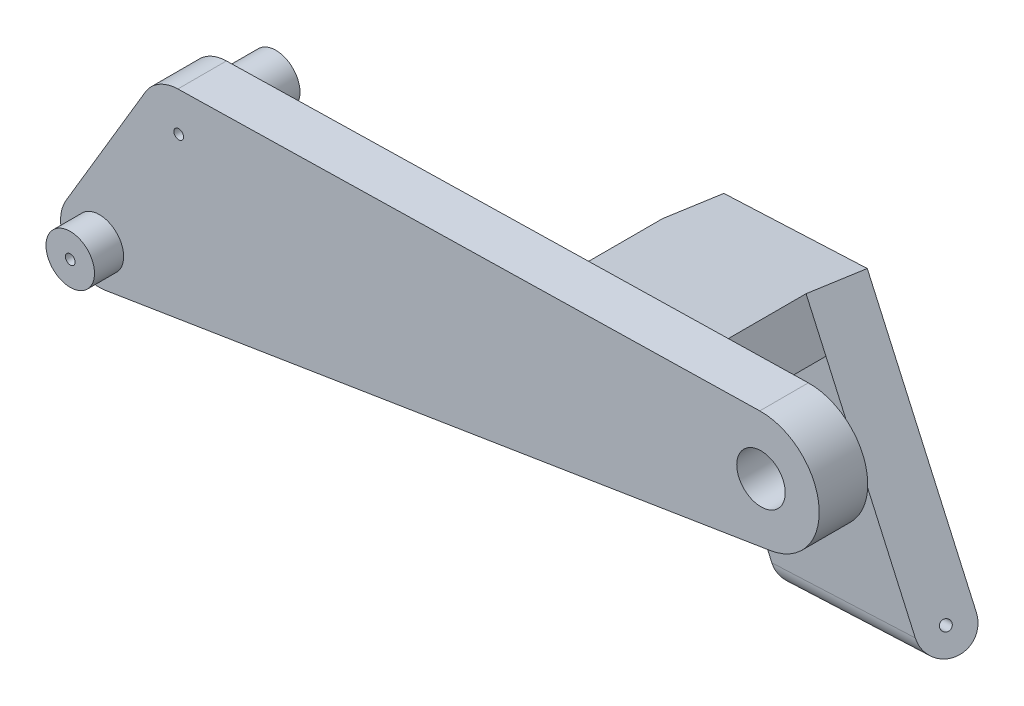
ISO-10303-21;
HEADER;
FILE_DESCRIPTION(('STEP AP214'),'2;1');
FILE_NAME('part.step','',(''),(''),'','','');
FILE_SCHEMA(('AUTOMOTIVE_DESIGN { 1 0 10303 214 1 1 1 1 }'));
ENDSEC;
DATA;
#1=APPLICATION_CONTEXT('core data for automotive mechanical design processes');
#2=APPLICATION_PROTOCOL_DEFINITION('international standard','automotive_design',2000,#1);
#3=PRODUCT_CONTEXT('',#1,'mechanical');
#4=PRODUCT('Part','Part','',(#3));
#5=PRODUCT_RELATED_PRODUCT_CATEGORY('part','',(#4));
#6=PRODUCT_DEFINITION_FORMATION('','',#4);
#7=PRODUCT_DEFINITION_CONTEXT('part definition',#1,'design');
#8=PRODUCT_DEFINITION('design','',#6,#7);
#9=PRODUCT_DEFINITION_SHAPE('','',#8);
#10=(LENGTH_UNIT() NAMED_UNIT(*) SI_UNIT(.MILLI.,.METRE.));
#11=(NAMED_UNIT(*) PLANE_ANGLE_UNIT() SI_UNIT($,.RADIAN.));
#12=(NAMED_UNIT(*) SI_UNIT($,.STERADIAN.) SOLID_ANGLE_UNIT());
#13=UNCERTAINTY_MEASURE_WITH_UNIT(LENGTH_MEASURE(1.E-05),#10,'distance_accuracy_value','');
#14=(GEOMETRIC_REPRESENTATION_CONTEXT(3) GLOBAL_UNCERTAINTY_ASSIGNED_CONTEXT((#13)) GLOBAL_UNIT_ASSIGNED_CONTEXT((#10,
#11,#12)) REPRESENTATION_CONTEXT('',''));
#15=CARTESIAN_POINT('',(0.,0.,0.));
#16=DIRECTION('',(0.,0.,1.));
#17=DIRECTION('',(1.,0.,0.));
#18=AXIS2_PLACEMENT_3D('',#15,#16,#17);
#19=CARTESIAN_POINT('',(62.4855106396352,-20.8616321514098,-11.5630037190644));
#20=DIRECTION('',(-0.851630372481686,-0.38188587271306,-0.359010987142299));
#21=DIRECTION('',(0.409163435049707,-0.912461113373235,0.));
#22=AXIS2_PLACEMENT_3D('',#19,#20,#21);
#23=CYLINDRICAL_SURFACE('',#22,2.5);
#24=DIRECTION('',(-0.851630372481686,-0.38188587271306,-0.359010987142299));
#25=VECTOR('',#24,1.);
#26=CARTESIAN_POINT('',(28.3053987541113,-36.1885888671463,-28.6504502948407));
#27=LINE('',#26,#25);
#28=CARTESIAN_POINT('',(63.304469552238,-20.4943967296105,-13.8963370523977));
#29=VERTEX_POINT('',#28);
#30=CARTESIAN_POINT('',(37.7555583777873,-31.9509729110023,-24.6666666666667));
#31=VERTEX_POINT('',#30);
#32=EDGE_CURVE('E137',#29,#31,#27,.T.);
#33=ORIENTED_EDGE('',*,*,#32,.F.);
#34=CARTESIAN_POINT('',(62.4855106396352,-20.8616321514098,-11.5630037190644));
#35=DIRECTION('',(-0.851630372481687,-0.38188587271306,-0.3590109871423));
#36=DIRECTION('',(0.409163435049707,-0.912461113373235,0.));
#37=AXIS2_PLACEMENT_3D('',#34,#35,#36);
#38=CIRCLE('',#37,2.5);
#39=CARTESIAN_POINT('',(61.6665517270325,-21.2288675732091,-9.22967038573104));
#40=VERTEX_POINT('',#39);
#41=EDGE_CURVE('E48',#40,#29,#38,.F.);
#42=ORIENTED_EDGE('',*,*,#41,.F.);
#43=DIRECTION('',(0.851630372481686,0.38188587271306,0.359010987142299));
#44=VECTOR('',#43,1.);
#45=CARTESIAN_POINT('',(61.6665517270325,-21.2288675732091,-9.22967038573105));
#46=LINE('',#45,#44);
#47=CARTESIAN_POINT('',(36.1176405525819,-32.6854437546009,-20.));
#48=VERTEX_POINT('',#47);
#49=EDGE_CURVE('E263',#48,#40,#46,.T.);
#50=ORIENTED_EDGE('',*,*,#49,.F.);
#51=CARTESIAN_POINT('',(36.9365994651846,-32.3182083328016,-22.3333333333334));
#52=DIRECTION('',(0.851630372481687,0.38188587271306,0.3590109871423));
#53=DIRECTION('',(-0.409163435049707,0.912461113373235,0.));
#54=AXIS2_PLACEMENT_3D('',#51,#52,#53);
#55=CIRCLE('',#54,2.5);
#56=EDGE_CURVE('E11',#31,#48,#55,.F.);
#57=ORIENTED_EDGE('',*,*,#56,.F.);
#58=EDGE_LOOP('',(#33,#42,#50,#57));
#59=FACE_BOUND('',#58,.T.);
#60=ADVANCED_FACE('F40',(#59),#23,.T.);
#61=CARTESIAN_POINT('',(0.,0.,0.));
#62=DIRECTION('',(0.,0.,1.));
#63=DIRECTION('',(1.,0.,0.));
#64=AXIS2_PLACEMENT_3D('',#61,#62,#63);
#65=PLANE('',#64);
#66=CARTESIAN_POINT('',(-8.17183168360859,-13.7557684966988,0.));
#67=DIRECTION('',(0.,0.,-1.));
#68=DIRECTION('',(-1.,0.,0.));
#69=AXIS2_PLACEMENT_3D('',#66,#67,#68);
#70=CIRCLE('',#69,0.500000000000003);
#71=CARTESIAN_POINT('',(-8.67183168360859,-13.7557684966988,0.));
#72=VERTEX_POINT('',#71);
#73=EDGE_CURVE('E191',#72,#72,#70,.T.);
#74=ORIENTED_EDGE('',*,*,#73,.F.);
#75=EDGE_LOOP('',(#74));
#76=FACE_BOUND('',#75,.T.);
#77=CARTESIAN_POINT('',(0.,0.,0.));
#78=DIRECTION('',(0.,0.,1.));
#79=DIRECTION('',(1.,0.,0.));
#80=AXIS2_PLACEMENT_3D('',#77,#78,#79);
#81=CIRCLE('',#80,2.5);
#82=CARTESIAN_POINT('',(2.5,0.,0.));
#83=VERTEX_POINT('',#82);
#84=EDGE_CURVE('E211',#83,#83,#81,.T.);
#85=ORIENTED_EDGE('',*,*,#84,.T.);
#86=EDGE_LOOP('',(#85));
#87=FACE_BOUND('',#86,.T.);
#88=CARTESIAN_POINT('',(60.,-0.746793782929104,0.));
#89=DIRECTION('',(0.,0.,-1.));
#90=DIRECTION('',(-1.,0.,0.));
#91=AXIS2_PLACEMENT_3D('',#88,#89,#90);
#92=CIRCLE('',#91,2.49999999999999);
#93=CARTESIAN_POINT('',(57.5,-0.746793782929104,0.));
#94=VERTEX_POINT('',#93);
#95=EDGE_CURVE('E187',#94,#94,#92,.T.);
#96=ORIENTED_EDGE('',*,*,#95,.F.);
#97=EDGE_LOOP('',(#96));
#98=FACE_BOUND('',#97,.T.);
#99=DIRECTION('',(-0.409163435049708,0.912461113373235,0.));
#100=VECTOR('',#99,1.);
#101=CARTESIAN_POINT('',(26.9114632639635,-12.1550687037031,0.));
#102=LINE('',#101,#100);
#103=CARTESIAN_POINT('',(26.9114632639635,-12.1550687037031,0.));
#104=VERTEX_POINT('',#103);
#105=CARTESIAN_POINT('',(24.8656460887149,-7.59276313683697,0.));
#106=VERTEX_POINT('',#105);
#107=EDGE_CURVE('E165',#104,#106,#102,.T.);
#108=ORIENTED_EDGE('',*,*,#107,.F.);
#109=DIRECTION('',(0.987269044442118,0.159059215031218,0.));
#110=VECTOR('',#109,1.);
#111=CARTESIAN_POINT('',(60.9543552901873,-6.67040804958181,0.));
#112=LINE('',#111,#110);
#113=CARTESIAN_POINT('',(-7.53559482348372,-17.7048446744673,0.));
#114=VERTEX_POINT('',#113);
#115=EDGE_CURVE('E240',#114,#104,#112,.T.);
#116=ORIENTED_EDGE('',*,*,#115,.F.);
#117=CARTESIAN_POINT('',(-8.17183168360859,-13.7557684966988,0.));
#118=DIRECTION('',(0.,0.,1.));
#119=DIRECTION('',(1.,0.,0.));
#120=AXIS2_PLACEMENT_3D('',#117,#118,#119);
#121=CIRCLE('',#120,4.);
#122=CARTESIAN_POINT('',(-11.6107738077833,-11.7128105757966,0.));
#123=VERTEX_POINT('',#122);
#124=EDGE_CURVE('E237',#123,#114,#121,.T.);
#125=ORIENTED_EDGE('',*,*,#124,.F.);
#126=DIRECTION('',(-0.510739480225537,-0.859735531043674,0.));
#127=VECTOR('',#126,1.);
#128=CARTESIAN_POINT('',(-11.6107738077833,-11.7128105757966,0.));
#129=LINE('',#128,#127);
#130=CARTESIAN_POINT('',(-3.4389421241747,2.04295792090215,0.));
#131=VERTEX_POINT('',#130);
#132=EDGE_CURVE('E235',#131,#123,#129,.T.);
#133=ORIENTED_EDGE('',*,*,#132,.F.);
#134=CARTESIAN_POINT('',(0.,0.,0.));
#135=DIRECTION('',(0.,0.,1.));
#136=DIRECTION('',(1.,0.,0.));
#137=AXIS2_PLACEMENT_3D('',#134,#135,#136);
#138=CIRCLE('',#137,4.);
#139=CARTESIAN_POINT('',(-0.0835579449526009,3.99912716349897,0.));
#140=VERTEX_POINT('',#139);
#141=EDGE_CURVE('E217',#140,#131,#138,.T.);
#142=ORIENTED_EDGE('',*,*,#141,.F.);
#143=DIRECTION('',(-0.999781790874742,-0.0208894862381503,0.));
#144=VECTOR('',#143,1.);
#145=CARTESIAN_POINT('',(-0.0835579449526009,3.99912716349897,0.));
#146=LINE('',#145,#144);
#147=CARTESIAN_POINT('',(59.8746630825711,5.25189696231935,0.));
#148=VERTEX_POINT('',#147);
#149=EDGE_CURVE('E222',#148,#140,#146,.T.);
#150=ORIENTED_EDGE('',*,*,#149,.F.);
#151=CARTESIAN_POINT('',(60.,-0.746793782929104,0.));
#152=DIRECTION('',(0.,0.,1.));
#153=DIRECTION('',(1.,0.,0.));
#154=AXIS2_PLACEMENT_3D('',#151,#152,#153);
#155=CIRCLE('',#154,6.);
#156=CARTESIAN_POINT('',(60.9543552901873,-6.67040804958181,0.));
#157=VERTEX_POINT('',#156);
#158=EDGE_CURVE('E242',#157,#148,#155,.T.);
#159=ORIENTED_EDGE('',*,*,#158,.F.);
#160=EDGE_CURVE('E239',#104,#157,#112,.T.);
#161=ORIENTED_EDGE('',*,*,#160,.F.);
#162=DIRECTION('',(-0.912461113373235,-0.409163435049707,0.));
#163=VECTOR('',#162,1.);
#164=CARTESIAN_POINT('',(26.9114632639635,-12.1550687037031,0.));
#165=LINE('',#164,#163);
#166=CARTESIAN_POINT('',(52.4603744384141,-0.698492522311342,0.));
#167=VERTEX_POINT('',#166);
#168=EDGE_CURVE('E168',#167,#104,#165,.T.);
#169=ORIENTED_EDGE('',*,*,#168,.F.);
#170=DIRECTION('',(0.40916343504971,-0.912461113373234,0.));
#171=VECTOR('',#170,1.);
#172=CARTESIAN_POINT('',(52.4603744384141,-0.698492522311339,0.));
#173=LINE('',#172,#171);
#174=CARTESIAN_POINT('',(50.4145572631655,3.86381304455483,0.));
#175=VERTEX_POINT('',#174);
#176=EDGE_CURVE('E174',#175,#167,#173,.T.);
#177=ORIENTED_EDGE('',*,*,#176,.F.);
#178=DIRECTION('',(0.912461113373235,0.409163435049707,0.));
#179=VECTOR('',#178,1.);
#180=CARTESIAN_POINT('',(24.8656460887149,-7.59276313683697,0.));
#181=LINE('',#180,#179);
#182=EDGE_CURVE('E171',#106,#175,#181,.T.);
#183=ORIENTED_EDGE('',*,*,#182,.F.);
#184=EDGE_LOOP('',(#108,#116,#125,#133,#142,#150,#159,#161,#169,#177,#183));
#185=FACE_BOUND('',#184,.T.);
#186=ADVANCED_FACE('F298',(#76,#87,#98,#185),#65,.F.);
#187=CARTESIAN_POINT('',(0.,0.,5.));
#188=DIRECTION('',(0.,0.,1.));
#189=DIRECTION('',(1.,0.,0.));
#190=AXIS2_PLACEMENT_3D('',#187,#188,#189);
#191=PLANE('',#190);
#192=CARTESIAN_POINT('',(60.,-0.746793782929104,5.));
#193=DIRECTION('',(0.,0.,-1.));
#194=DIRECTION('',(-1.,0.,0.));
#195=AXIS2_PLACEMENT_3D('',#192,#193,#194);
#196=CIRCLE('',#195,2.49999999999999);
#197=CARTESIAN_POINT('',(57.5,-0.746793782929104,5.));
#198=VERTEX_POINT('',#197);
#199=EDGE_CURVE('E188',#198,#198,#196,.T.);
#200=ORIENTED_EDGE('',*,*,#199,.T.);
#201=EDGE_LOOP('',(#200));
#202=FACE_BOUND('',#201,.T.);
#203=CARTESIAN_POINT('',(-8.17183168360859,-13.7557684966988,5.));
#204=DIRECTION('',(0.,0.,1.));
#205=DIRECTION('',(1.,0.,0.));
#206=AXIS2_PLACEMENT_3D('',#203,#204,#205);
#207=CIRCLE('',#206,2.5);
#208=CARTESIAN_POINT('',(-5.67183168360859,-13.7557684966988,5.));
#209=VERTEX_POINT('',#208);
#210=EDGE_CURVE('E214',#209,#209,#207,.T.);
#211=ORIENTED_EDGE('',*,*,#210,.F.);
#212=EDGE_LOOP('',(#211));
#213=FACE_BOUND('',#212,.T.);
#214=CARTESIAN_POINT('',(0.,0.,5.));
#215=DIRECTION('',(0.,0.,1.));
#216=DIRECTION('',(1.,0.,0.));
#217=AXIS2_PLACEMENT_3D('',#214,#215,#216);
#218=CIRCLE('',#217,4.);
#219=CARTESIAN_POINT('',(-0.0835579449526009,3.99912716349897,5.));
#220=VERTEX_POINT('',#219);
#221=CARTESIAN_POINT('',(-3.4389421241747,2.04295792090215,5.));
#222=VERTEX_POINT('',#221);
#223=EDGE_CURVE('E218',#220,#222,#218,.T.);
#224=ORIENTED_EDGE('',*,*,#223,.T.);
#225=DIRECTION('',(-0.510739480225537,-0.859735531043674,0.));
#226=VECTOR('',#225,1.);
#227=CARTESIAN_POINT('',(-11.6107738077833,-11.7128105757966,5.));
#228=LINE('',#227,#226);
#229=CARTESIAN_POINT('',(-11.6107738077833,-11.7128105757966,5.));
#230=VERTEX_POINT('',#229);
#231=EDGE_CURVE('E221',#222,#230,#228,.T.);
#232=ORIENTED_EDGE('',*,*,#231,.T.);
#233=CARTESIAN_POINT('',(-8.17183168360859,-13.7557684966988,5.));
#234=DIRECTION('',(0.,0.,1.));
#235=DIRECTION('',(1.,0.,0.));
#236=AXIS2_PLACEMENT_3D('',#233,#234,#235);
#237=CIRCLE('',#236,4.);
#238=CARTESIAN_POINT('',(-7.53559482348372,-17.7048446744673,5.));
#239=VERTEX_POINT('',#238);
#240=EDGE_CURVE('E224',#230,#239,#237,.T.);
#241=ORIENTED_EDGE('',*,*,#240,.T.);
#242=DIRECTION('',(0.987269044442118,0.159059215031218,0.));
#243=VECTOR('',#242,1.);
#244=CARTESIAN_POINT('',(60.9543552901873,-6.67040804958181,5.));
#245=LINE('',#244,#243);
#246=CARTESIAN_POINT('',(60.9543552901873,-6.67040804958181,5.));
#247=VERTEX_POINT('',#246);
#248=EDGE_CURVE('E226',#239,#247,#245,.T.);
#249=ORIENTED_EDGE('',*,*,#248,.T.);
#250=CARTESIAN_POINT('',(60.,-0.746793782929104,5.));
#251=DIRECTION('',(0.,0.,1.));
#252=DIRECTION('',(1.,0.,0.));
#253=AXIS2_PLACEMENT_3D('',#250,#251,#252);
#254=CIRCLE('',#253,6.);
#255=CARTESIAN_POINT('',(59.8746630825711,5.25189696231935,5.));
#256=VERTEX_POINT('',#255);
#257=EDGE_CURVE('E228',#247,#256,#254,.T.);
#258=ORIENTED_EDGE('',*,*,#257,.T.);
#259=DIRECTION('',(-0.999781790874742,-0.0208894862381503,0.));
#260=VECTOR('',#259,1.);
#261=CARTESIAN_POINT('',(-0.0835579449526009,3.99912716349897,5.));
#262=LINE('',#261,#260);
#263=EDGE_CURVE('E230',#256,#220,#262,.T.);
#264=ORIENTED_EDGE('',*,*,#263,.T.);
#265=EDGE_LOOP('',(#224,#232,#241,#249,#258,#264));
#266=FACE_BOUND('',#265,.T.);
#267=CARTESIAN_POINT('',(0.,0.,5.));
#268=DIRECTION('',(0.,0.,1.));
#269=DIRECTION('',(1.,0.,0.));
#270=AXIS2_PLACEMENT_3D('',#267,#268,#269);
#271=CIRCLE('',#270,0.5);
#272=CARTESIAN_POINT('',(0.5,0.,5.));
#273=VERTEX_POINT('',#272);
#274=EDGE_CURVE('E202',#273,#273,#271,.T.);
#275=ORIENTED_EDGE('',*,*,#274,.F.);
#276=EDGE_LOOP('',(#275));
#277=FACE_BOUND('',#276,.T.);
#278=ADVANCED_FACE('F302',(#202,#213,#266,#277),#191,.T.);
#279=CARTESIAN_POINT('',(0.,0.,5.));
#280=DIRECTION('',(0.,0.,-1.));
#281=DIRECTION('',(-1.,0.,0.));
#282=AXIS2_PLACEMENT_3D('',#279,#280,#281);
#283=CYLINDRICAL_SURFACE('',#282,4.);
#284=ORIENTED_EDGE('',*,*,#141,.T.);
#285=DIRECTION('',(0.,0.,-1.));
#286=VECTOR('',#285,1.);
#287=CARTESIAN_POINT('',(-3.4389421241747,2.04295792090215,5.));
#288=LINE('',#287,#286);
#289=EDGE_CURVE('E259',#222,#131,#288,.T.);
#290=ORIENTED_EDGE('',*,*,#289,.F.);
#291=ORIENTED_EDGE('',*,*,#223,.F.);
#292=DIRECTION('',(0.,0.,-1.));
#293=VECTOR('',#292,1.);
#294=CARTESIAN_POINT('',(-0.0835579449526009,3.99912716349897,5.));
#295=LINE('',#294,#293);
#296=EDGE_CURVE('E232',#220,#140,#295,.T.);
#297=ORIENTED_EDGE('',*,*,#296,.T.);
#298=EDGE_LOOP('',(#284,#290,#291,#297));
#299=FACE_BOUND('',#298,.T.);
#300=ADVANCED_FACE('F308',(#299),#283,.T.);
#301=CARTESIAN_POINT('',(-11.6107738077833,-11.7128105757966,5.));
#302=DIRECTION('',(0.859735531043674,-0.510739480225537,0.));
#303=DIRECTION('',(0.510739480225537,0.859735531043674,0.));
#304=AXIS2_PLACEMENT_3D('',#301,#302,#303);
#305=PLANE('',#304);
#306=ORIENTED_EDGE('',*,*,#132,.T.);
#307=DIRECTION('',(0.,0.,-1.));
#308=VECTOR('',#307,1.);
#309=CARTESIAN_POINT('',(-11.6107738077833,-11.7128105757966,5.));
#310=LINE('',#309,#308);
#311=EDGE_CURVE('E256',#230,#123,#310,.T.);
#312=ORIENTED_EDGE('',*,*,#311,.F.);
#313=ORIENTED_EDGE('',*,*,#231,.F.);
#314=ORIENTED_EDGE('',*,*,#289,.T.);
#315=EDGE_LOOP('',(#306,#312,#313,#314));
#316=FACE_BOUND('',#315,.T.);
#317=ADVANCED_FACE('F331',(#316),#305,.F.);
#318=CARTESIAN_POINT('',(-8.17183168360859,-13.7557684966988,5.));
#319=DIRECTION('',(0.,0.,-1.));
#320=DIRECTION('',(-1.,0.,0.));
#321=AXIS2_PLACEMENT_3D('',#318,#319,#320);
#322=CYLINDRICAL_SURFACE('',#321,4.);
#323=ORIENTED_EDGE('',*,*,#124,.T.);
#324=DIRECTION('',(0.,0.,-1.));
#325=VECTOR('',#324,1.);
#326=CARTESIAN_POINT('',(-7.53559482348372,-17.7048446744673,5.));
#327=LINE('',#326,#325);
#328=EDGE_CURVE('E253',#239,#114,#327,.T.);
#329=ORIENTED_EDGE('',*,*,#328,.F.);
#330=ORIENTED_EDGE('',*,*,#240,.F.);
#331=ORIENTED_EDGE('',*,*,#311,.T.);
#332=EDGE_LOOP('',(#323,#329,#330,#331));
#333=FACE_BOUND('',#332,.T.);
#334=ADVANCED_FACE('F327',(#333),#322,.T.);
#335=CARTESIAN_POINT('',(60.9543552901873,-6.67040804958181,5.));
#336=DIRECTION('',(-0.159059215031218,0.987269044442118,0.));
#337=DIRECTION('',(-0.987269044442118,-0.159059215031218,0.));
#338=AXIS2_PLACEMENT_3D('',#335,#336,#337);
#339=PLANE('',#338);
#340=ORIENTED_EDGE('',*,*,#115,.T.);
#341=ORIENTED_EDGE('',*,*,#160,.T.);
#342=DIRECTION('',(0.,0.,-1.));
#343=VECTOR('',#342,1.);
#344=CARTESIAN_POINT('',(60.9543552901873,-6.67040804958181,5.));
#345=LINE('',#344,#343);
#346=EDGE_CURVE('E250',#247,#157,#345,.T.);
#347=ORIENTED_EDGE('',*,*,#346,.F.);
#348=ORIENTED_EDGE('',*,*,#248,.F.);
#349=ORIENTED_EDGE('',*,*,#328,.T.);
#350=EDGE_LOOP('',(#340,#341,#347,#348,#349));
#351=FACE_BOUND('',#350,.T.);
#352=ADVANCED_FACE('F323',(#351),#339,.F.);
#353=CARTESIAN_POINT('',(60.,-0.746793782929104,5.));
#354=DIRECTION('',(0.,0.,-1.));
#355=DIRECTION('',(-1.,0.,0.));
#356=AXIS2_PLACEMENT_3D('',#353,#354,#355);
#357=CYLINDRICAL_SURFACE('',#356,6.);
#358=ORIENTED_EDGE('',*,*,#158,.T.);
#359=DIRECTION('',(0.,0.,-1.));
#360=VECTOR('',#359,1.);
#361=CARTESIAN_POINT('',(59.8746630825711,5.25189696231935,5.));
#362=LINE('',#361,#360);
#363=EDGE_CURVE('E247',#256,#148,#362,.T.);
#364=ORIENTED_EDGE('',*,*,#363,.F.);
#365=ORIENTED_EDGE('',*,*,#257,.F.);
#366=ORIENTED_EDGE('',*,*,#346,.T.);
#367=EDGE_LOOP('',(#358,#364,#365,#366));
#368=FACE_BOUND('',#367,.T.);
#369=ADVANCED_FACE('F319',(#368),#357,.T.);
#370=CARTESIAN_POINT('',(-0.0835579449526009,3.99912716349897,5.));
#371=DIRECTION('',(0.0208894862381503,-0.999781790874742,0.));
#372=DIRECTION('',(0.999781790874742,0.0208894862381503,0.));
#373=AXIS2_PLACEMENT_3D('',#370,#371,#372);
#374=PLANE('',#373);
#375=ORIENTED_EDGE('',*,*,#149,.T.);
#376=ORIENTED_EDGE('',*,*,#296,.F.);
#377=ORIENTED_EDGE('',*,*,#263,.F.);
#378=ORIENTED_EDGE('',*,*,#363,.T.);
#379=EDGE_LOOP('',(#375,#376,#377,#378));
#380=FACE_BOUND('',#379,.T.);
#381=ADVANCED_FACE('F315',(#380),#374,.F.);
#382=CARTESIAN_POINT('',(0.,0.,-5.));
#383=DIRECTION('',(0.,0.,1.));
#384=DIRECTION('',(1.,0.,0.));
#385=AXIS2_PLACEMENT_3D('',#382,#383,#384);
#386=CYLINDRICAL_SURFACE('',#385,2.5);
#387=CARTESIAN_POINT('',(0.,0.,-5.));
#388=DIRECTION('',(0.,0.,1.));
#389=DIRECTION('',(1.,0.,0.));
#390=AXIS2_PLACEMENT_3D('',#387,#388,#389);
#391=CIRCLE('',#390,2.5);
#392=CARTESIAN_POINT('',(2.5,0.,-5.));
#393=VERTEX_POINT('',#392);
#394=EDGE_CURVE('E206',#393,#393,#391,.T.);
#395=ORIENTED_EDGE('',*,*,#394,.T.);
#396=EDGE_LOOP('',(#395));
#397=FACE_BOUND('',#396,.T.);
#398=ORIENTED_EDGE('',*,*,#84,.F.);
#399=EDGE_LOOP('',(#398));
#400=FACE_BOUND('',#399,.T.);
#401=ADVANCED_FACE('F318',(#397,#400),#386,.T.);
#402=CARTESIAN_POINT('',(0.,0.,-5.));
#403=DIRECTION('',(0.,0.,1.));
#404=DIRECTION('',(1.,0.,0.));
#405=AXIS2_PLACEMENT_3D('',#402,#403,#404);
#406=PLANE('',#405);
#407=CARTESIAN_POINT('',(0.,0.,-5.));
#408=DIRECTION('',(0.,0.,1.));
#409=DIRECTION('',(1.,0.,0.));
#410=AXIS2_PLACEMENT_3D('',#407,#408,#409);
#411=CIRCLE('',#410,0.5);
#412=CARTESIAN_POINT('',(0.5,0.,-5.));
#413=VERTEX_POINT('',#412);
#414=EDGE_CURVE('E203',#413,#413,#411,.T.);
#415=ORIENTED_EDGE('',*,*,#414,.T.);
#416=EDGE_LOOP('',(#415));
#417=FACE_BOUND('',#416,.T.);
#418=ORIENTED_EDGE('',*,*,#394,.F.);
#419=EDGE_LOOP('',(#418));
#420=FACE_BOUND('',#419,.T.);
#421=ADVANCED_FACE('F396',(#417,#420),#406,.F.);
#422=CARTESIAN_POINT('',(0.,0.,-5.));
#423=DIRECTION('',(0.,0.,1.));
#424=DIRECTION('',(1.,0.,0.));
#425=AXIS2_PLACEMENT_3D('',#422,#423,#424);
#426=CYLINDRICAL_SURFACE('',#425,0.5);
#427=ORIENTED_EDGE('',*,*,#414,.F.);
#428=EDGE_LOOP('',(#427));
#429=FACE_BOUND('',#428,.T.);
#430=ORIENTED_EDGE('',*,*,#274,.T.);
#431=EDGE_LOOP('',(#430));
#432=FACE_BOUND('',#431,.T.);
#433=ADVANCED_FACE('F392',(#429,#432),#426,.F.);
#434=CARTESIAN_POINT('',(-8.17183168360859,-13.7557684966988,8.));
#435=DIRECTION('',(0.,0.,-1.));
#436=DIRECTION('',(-1.,0.,0.));
#437=AXIS2_PLACEMENT_3D('',#434,#435,#436);
#438=CYLINDRICAL_SURFACE('',#437,2.5);
#439=ORIENTED_EDGE('',*,*,#210,.T.);
#440=EDGE_LOOP('',(#439));
#441=FACE_BOUND('',#440,.T.);
#442=CARTESIAN_POINT('',(-8.17183168360859,-13.7557684966988,8.));
#443=DIRECTION('',(0.,0.,-1.));
#444=DIRECTION('',(-1.,0.,0.));
#445=AXIS2_PLACEMENT_3D('',#442,#443,#444);
#446=CIRCLE('',#445,2.5);
#447=CARTESIAN_POINT('',(-10.6718316836086,-13.7557684966988,8.));
#448=VERTEX_POINT('',#447);
#449=EDGE_CURVE('E197',#448,#448,#446,.T.);
#450=ORIENTED_EDGE('',*,*,#449,.T.);
#451=EDGE_LOOP('',(#450));
#452=FACE_BOUND('',#451,.T.);
#453=ADVANCED_FACE('F388',(#441,#452),#438,.T.);
#454=CARTESIAN_POINT('',(-8.17183168360859,-13.7557684966988,8.));
#455=DIRECTION('',(0.,0.,-1.));
#456=DIRECTION('',(-1.,0.,0.));
#457=AXIS2_PLACEMENT_3D('',#454,#455,#456);
#458=PLANE('',#457);
#459=CARTESIAN_POINT('',(-8.17183168360859,-13.7557684966988,8.));
#460=DIRECTION('',(0.,0.,-1.));
#461=DIRECTION('',(-1.,0.,0.));
#462=AXIS2_PLACEMENT_3D('',#459,#460,#461);
#463=CIRCLE('',#462,0.500000000000003);
#464=CARTESIAN_POINT('',(-8.67183168360859,-13.7557684966988,8.));
#465=VERTEX_POINT('',#464);
#466=EDGE_CURVE('E194',#465,#465,#463,.T.);
#467=ORIENTED_EDGE('',*,*,#466,.T.);
#468=EDGE_LOOP('',(#467));
#469=FACE_BOUND('',#468,.T.);
#470=ORIENTED_EDGE('',*,*,#449,.F.);
#471=EDGE_LOOP('',(#470));
#472=FACE_BOUND('',#471,.T.);
#473=ADVANCED_FACE('F384',(#469,#472),#458,.F.);
#474=CARTESIAN_POINT('',(-8.17183168360859,-13.7557684966988,8.));
#475=DIRECTION('',(0.,0.,-1.));
#476=DIRECTION('',(-1.,0.,0.));
#477=AXIS2_PLACEMENT_3D('',#474,#475,#476);
#478=CYLINDRICAL_SURFACE('',#477,0.500000000000003);
#479=ORIENTED_EDGE('',*,*,#466,.F.);
#480=EDGE_LOOP('',(#479));
#481=FACE_BOUND('',#480,.T.);
#482=ORIENTED_EDGE('',*,*,#73,.T.);
#483=EDGE_LOOP('',(#482));
#484=FACE_BOUND('',#483,.T.);
#485=ADVANCED_FACE('F380',(#481,#484),#478,.F.);
#486=CARTESIAN_POINT('',(60.,-0.746793782929104,5.));
#487=DIRECTION('',(0.,0.,-1.));
#488=DIRECTION('',(-1.,0.,0.));
#489=AXIS2_PLACEMENT_3D('',#486,#487,#488);
#490=CYLINDRICAL_SURFACE('',#489,2.49999999999999);
#491=ORIENTED_EDGE('',*,*,#199,.F.);
#492=EDGE_LOOP('',(#491));
#493=FACE_BOUND('',#492,.T.);
#494=ORIENTED_EDGE('',*,*,#95,.T.);
#495=EDGE_LOOP('',(#494));
#496=FACE_BOUND('',#495,.T.);
#497=ADVANCED_FACE('F377',(#493,#496),#490,.F.);
#498=CARTESIAN_POINT('',(26.9114632639635,-12.1550687037031,-20.));
#499=DIRECTION('',(0.912461113373235,0.409163435049708,0.));
#500=DIRECTION('',(-0.409163435049708,0.912461113373235,0.));
#501=AXIS2_PLACEMENT_3D('',#498,#499,#500);
#502=PLANE('',#501);
#503=ORIENTED_EDGE('',*,*,#107,.T.);
#504=DIRECTION('',(0.,0.,1.));
#505=VECTOR('',#504,1.);
#506=CARTESIAN_POINT('',(24.8656460887149,-7.59276313683697,-20.));
#507=LINE('',#506,#505);
#508=CARTESIAN_POINT('',(24.865646088715,-7.59276313683697,-20.));
#509=VERTEX_POINT('',#508);
#510=EDGE_CURVE('E185',#509,#106,#507,.T.);
#511=ORIENTED_EDGE('',*,*,#510,.F.);
#512=DIRECTION('',(-0.409163435049708,0.912461113373235,0.));
#513=VECTOR('',#512,1.);
#514=CARTESIAN_POINT('',(26.9114632639635,-12.1550687037031,-20.));
#515=LINE('',#514,#513);
#516=CARTESIAN_POINT('',(26.9114632639635,-12.1550687037031,-20.));
#517=VERTEX_POINT('',#516);
#518=EDGE_CURVE('E154',#517,#509,#515,.T.);
#519=ORIENTED_EDGE('',*,*,#518,.F.);
#520=DIRECTION('',(0.,0.,1.));
#521=VECTOR('',#520,1.);
#522=CARTESIAN_POINT('',(26.9114632639635,-12.1550687037031,-20.));
#523=LINE('',#522,#521);
#524=EDGE_CURVE('E167',#517,#104,#523,.T.);
#525=ORIENTED_EDGE('',*,*,#524,.T.);
#526=EDGE_LOOP('',(#503,#511,#519,#525));
#527=FACE_BOUND('',#526,.T.);
#528=ADVANCED_FACE('F364',(#527),#502,.F.);
#529=CARTESIAN_POINT('',(24.8656460887149,-7.59276313683697,-20.));
#530=DIRECTION('',(0.409163435049707,-0.912461113373235,0.));
#531=DIRECTION('',(0.912461113373235,0.409163435049707,0.));
#532=AXIS2_PLACEMENT_3D('',#529,#530,#531);
#533=PLANE('',#532);
#534=DIRECTION('',(0.,0.,1.));
#535=VECTOR('',#534,1.);
#536=CARTESIAN_POINT('',(50.4145572631655,3.86381304455483,-20.));
#537=LINE('',#536,#535);
#538=CARTESIAN_POINT('',(50.4145572631655,3.86381304455484,-9.22967038573102));
#539=VERTEX_POINT('',#538);
#540=EDGE_CURVE('E183',#539,#175,#537,.T.);
#541=ORIENTED_EDGE('',*,*,#540,.F.);
#542=DIRECTION('',(-0.327583565041087,-0.14689416871973,0.933333333333334));
#543=VECTOR('',#542,1.);
#544=CARTESIAN_POINT('',(52.052475088371,4.59828388815349,-13.8963370523977));
#545=LINE('',#544,#543);
#546=CARTESIAN_POINT('',(52.052475088371,4.59828388815349,-13.8963370523977));
#547=VERTEX_POINT('',#546);
#548=EDGE_CURVE('E148',#547,#539,#545,.T.);
#549=ORIENTED_EDGE('',*,*,#548,.F.);
#550=DIRECTION('',(0.851630372481686,0.38188587271306,0.359010987142299));
#551=VECTOR('',#550,1.);
#552=CARTESIAN_POINT('',(26.5035639139204,-6.85829229323832,-24.6666666666667));
#553=LINE('',#552,#551);
#554=CARTESIAN_POINT('',(26.5035639139204,-6.85829229323832,-24.6666666666667));
#555=VERTEX_POINT('',#554);
#556=EDGE_CURVE('E135',#555,#547,#553,.T.);
#557=ORIENTED_EDGE('',*,*,#556,.F.);
#558=DIRECTION('',(-0.327583565041087,-0.14689416871973,0.933333333333334));
#559=VECTOR('',#558,1.);
#560=CARTESIAN_POINT('',(26.5035639139204,-6.85829229323832,-24.6666666666667));
#561=LINE('',#560,#559);
#562=EDGE_CURVE('E146',#555,#509,#561,.T.);
#563=ORIENTED_EDGE('',*,*,#562,.T.);
#564=ORIENTED_EDGE('',*,*,#510,.T.);
#565=ORIENTED_EDGE('',*,*,#182,.T.);
#566=EDGE_LOOP('',(#541,#549,#557,#563,#564,#565));
#567=FACE_BOUND('',#566,.T.);
#568=ADVANCED_FACE('F144',(#567),#533,.F.);
#569=CARTESIAN_POINT('',(52.4603744384141,-0.698492522311339,-20.));
#570=DIRECTION('',(-0.912461113373234,-0.40916343504971,0.));
#571=DIRECTION('',(0.40916343504971,-0.912461113373234,0.));
#572=AXIS2_PLACEMENT_3D('',#569,#570,#571);
#573=PLANE('',#572);
#574=DIRECTION('',(0.,0.,1.));
#575=VECTOR('',#574,1.);
#576=CARTESIAN_POINT('',(52.4603744384141,-0.698492522311339,-20.));
#577=LINE('',#576,#575);
#578=CARTESIAN_POINT('',(52.4603744384141,-0.698492522311338,-9.22967038573103));
#579=VERTEX_POINT('',#578);
#580=EDGE_CURVE('E181',#579,#167,#577,.T.);
#581=ORIENTED_EDGE('',*,*,#580,.F.);
#582=DIRECTION('',(-0.409163435049707,0.912461113373235,0.));
#583=VECTOR('',#582,1.);
#584=CARTESIAN_POINT('',(52.4603744384141,-0.698492522311339,-9.22967038573102));
#585=LINE('',#584,#583);
#586=EDGE_CURVE('E158',#579,#539,#585,.T.);
#587=ORIENTED_EDGE('',*,*,#586,.T.);
#588=ORIENTED_EDGE('',*,*,#540,.T.);
#589=ORIENTED_EDGE('',*,*,#176,.T.);
#590=EDGE_LOOP('',(#581,#587,#588,#589));
#591=FACE_BOUND('',#590,.T.);
#592=ADVANCED_FACE('F366',(#591),#573,.F.);
#593=CARTESIAN_POINT('',(26.9114632639635,-12.1550687037031,-20.));
#594=DIRECTION('',(-0.409163435049707,0.912461113373235,0.));
#595=DIRECTION('',(-0.912461113373235,-0.409163435049707,0.));
#596=AXIS2_PLACEMENT_3D('',#593,#594,#595);
#597=PLANE('',#596);
#598=ORIENTED_EDGE('',*,*,#524,.F.);
#599=DIRECTION('',(0.851630372481686,0.38188587271306,0.359010987142299));
#600=VECTOR('',#599,1.);
#601=CARTESIAN_POINT('',(52.4603744384141,-0.698492522311339,-9.22967038573102));
#602=LINE('',#601,#600);
#603=EDGE_CURVE('E155',#517,#579,#602,.T.);
#604=ORIENTED_EDGE('',*,*,#603,.T.);
#605=ORIENTED_EDGE('',*,*,#580,.T.);
#606=ORIENTED_EDGE('',*,*,#168,.T.);
#607=EDGE_LOOP('',(#598,#604,#605,#606));
#608=FACE_BOUND('',#607,.T.);
#609=ADVANCED_FACE('F293',(#608),#597,.F.);
#610=CARTESIAN_POINT('',(8.41788572581209,3.77472638444408,-23.983783628174));
#611=DIRECTION('',(-0.327583565041087,-0.146894168719729,0.933333333333334));
#612=DIRECTION('',(0.943568967215344,0.,0.331176092295577));
#613=AXIS2_PLACEMENT_3D('',#610,#611,#612);
#614=PLANE('',#613);
#615=DIRECTION('',(-0.409163435049707,0.912461113373235,0.));
#616=VECTOR('',#615,1.);
#617=CARTESIAN_POINT('',(24.865646088715,-7.59276313683697,-20.));
#618=LINE('',#617,#616);
#619=EDGE_CURVE('E270',#48,#517,#618,.T.);
#620=ORIENTED_EDGE('',*,*,#619,.F.);
#621=ORIENTED_EDGE('',*,*,#49,.T.);
#622=DIRECTION('',(0.409163435049707,-0.912461113373235,0.));
#623=VECTOR('',#622,1.);
#624=CARTESIAN_POINT('',(50.4145572631656,3.86381304455484,-9.22967038573103));
#625=LINE('',#624,#623);
#626=EDGE_CURVE('E139',#579,#40,#625,.T.);
#627=ORIENTED_EDGE('',*,*,#626,.F.);
#628=ORIENTED_EDGE('',*,*,#603,.F.);
#629=EDGE_LOOP('',(#620,#621,#627,#628));
#630=FACE_BOUND('',#629,.T.);
#631=ADVANCED_FACE('F286',(#630),#614,.T.);
#632=CARTESIAN_POINT('',(26.5035639139204,-6.85829229323832,-24.6666666666667));
#633=DIRECTION('',(0.851630372481687,0.38188587271306,0.3590109871423));
#634=DIRECTION('',(-0.409163435049707,0.912461113373235,0.));
#635=AXIS2_PLACEMENT_3D('',#632,#633,#634);
#636=PLANE('',#635);
#637=CARTESIAN_POINT('',(36.9365994651846,-32.3182083328016,-22.3333333333333));
#638=DIRECTION('',(-0.851630372481686,-0.38188587271306,-0.3590109871423));
#639=DIRECTION('',(0.409163435049707,-0.912461113373235,0.));
#640=AXIS2_PLACEMENT_3D('',#637,#638,#639);
#641=CIRCLE('',#640,0.500000000000002);
#642=CARTESIAN_POINT('',(37.1411811827095,-32.7744388894883,-22.3333333333333));
#643=VERTEX_POINT('',#642);
#644=EDGE_CURVE('E275',#643,#643,#641,.T.);
#645=ORIENTED_EDGE('',*,*,#644,.F.);
#646=EDGE_LOOP('',(#645));
#647=FACE_BOUND('',#646,.T.);
#648=DIRECTION('',(-0.409163435049707,0.912461113373235,0.));
#649=VECTOR('',#648,1.);
#650=CARTESIAN_POINT('',(26.5035639139204,-6.85829229323832,-24.6666666666667));
#651=LINE('',#650,#649);
#652=EDGE_CURVE('E131',#31,#555,#651,.T.);
#653=ORIENTED_EDGE('',*,*,#652,.F.);
#654=ORIENTED_EDGE('',*,*,#56,.T.);
#655=ORIENTED_EDGE('',*,*,#619,.T.);
#656=ORIENTED_EDGE('',*,*,#518,.T.);
#657=ORIENTED_EDGE('',*,*,#562,.F.);
#658=EDGE_LOOP('',(#653,#654,#655,#656,#657));
#659=FACE_BOUND('',#658,.T.);
#660=ADVANCED_FACE('F152',(#647,#659),#636,.F.);
#661=CARTESIAN_POINT('',(52.052475088371,4.59828388815349,-13.8963370523977));
#662=DIRECTION('',(-0.851630372481687,-0.38188587271306,-0.3590109871423));
#663=DIRECTION('',(0.409163435049707,-0.912461113373235,0.));
#664=AXIS2_PLACEMENT_3D('',#661,#662,#663);
#665=PLANE('',#664);
#666=CARTESIAN_POINT('',(62.4855106396352,-20.8616321514098,-11.5630037190644));
#667=DIRECTION('',(-0.851630372481686,-0.38188587271306,-0.3590109871423));
#668=DIRECTION('',(0.409163435049707,-0.912461113373235,0.));
#669=AXIS2_PLACEMENT_3D('',#666,#667,#668);
#670=CIRCLE('',#669,0.500000000000002);
#671=CARTESIAN_POINT('',(62.6900923571601,-21.3178627080965,-11.5630037190644));
#672=VERTEX_POINT('',#671);
#673=EDGE_CURVE('E271',#672,#672,#670,.T.);
#674=ORIENTED_EDGE('',*,*,#673,.T.);
#675=EDGE_LOOP('',(#674));
#676=FACE_BOUND('',#675,.T.);
#677=ORIENTED_EDGE('',*,*,#626,.T.);
#678=ORIENTED_EDGE('',*,*,#41,.T.);
#679=DIRECTION('',(0.409163435049707,-0.912461113373235,0.));
#680=VECTOR('',#679,1.);
#681=CARTESIAN_POINT('',(52.052475088371,4.59828388815349,-13.8963370523977));
#682=LINE('',#681,#680);
#683=EDGE_CURVE('E150',#547,#29,#682,.T.);
#684=ORIENTED_EDGE('',*,*,#683,.F.);
#685=ORIENTED_EDGE('',*,*,#548,.T.);
#686=ORIENTED_EDGE('',*,*,#586,.F.);
#687=EDGE_LOOP('',(#677,#678,#684,#685,#686));
#688=FACE_BOUND('',#687,.T.);
#689=ADVANCED_FACE('F266',(#676,#688),#665,.F.);
#690=CARTESIAN_POINT('',(10.0558035510175,4.50919722804273,-28.6504502948407));
#691=DIRECTION('',(-0.327583565041087,-0.146894168719729,0.933333333333334));
#692=DIRECTION('',(0.943568967215344,0.,0.331176092295577));
#693=AXIS2_PLACEMENT_3D('',#690,#691,#692);
#694=PLANE('',#693);
#695=ORIENTED_EDGE('',*,*,#683,.T.);
#696=ORIENTED_EDGE('',*,*,#32,.T.);
#697=ORIENTED_EDGE('',*,*,#652,.T.);
#698=ORIENTED_EDGE('',*,*,#556,.T.);
#699=EDGE_LOOP('',(#695,#696,#697,#698));
#700=FACE_BOUND('',#699,.T.);
#701=ADVANCED_FACE('F134',(#700),#694,.F.);
#702=CARTESIAN_POINT('',(62.4855106396352,-20.8616321514098,-11.5630037190644));
#703=DIRECTION('',(-0.851630372481686,-0.38188587271306,-0.3590109871423));
#704=DIRECTION('',(0.409163435049707,-0.912461113373235,0.));
#705=AXIS2_PLACEMENT_3D('',#702,#703,#704);
#706=CYLINDRICAL_SURFACE('',#705,0.500000000000002);
#707=ORIENTED_EDGE('',*,*,#673,.F.);
#708=EDGE_LOOP('',(#707));
#709=FACE_BOUND('',#708,.T.);
#710=ORIENTED_EDGE('',*,*,#644,.T.);
#711=EDGE_LOOP('',(#710));
#712=FACE_BOUND('',#711,.T.);
#713=ADVANCED_FACE('F283',(#709,#712),#706,.F.);
#714=CLOSED_SHELL('',(#60,#186,#278,#300,#317,#334,#352,#369,#381,#401,#421,#433,#453,#473,#485,
#497,#528,#568,#592,#609,#631,#660,#689,#701,#713));
#715=MANIFOLD_SOLID_BREP('B2',#714);
#716=ADVANCED_BREP_SHAPE_REPRESENTATION('',(#18,#715),#14);
#717=SHAPE_DEFINITION_REPRESENTATION(#9,#716);
ENDSEC;
END-ISO-10303-21;
